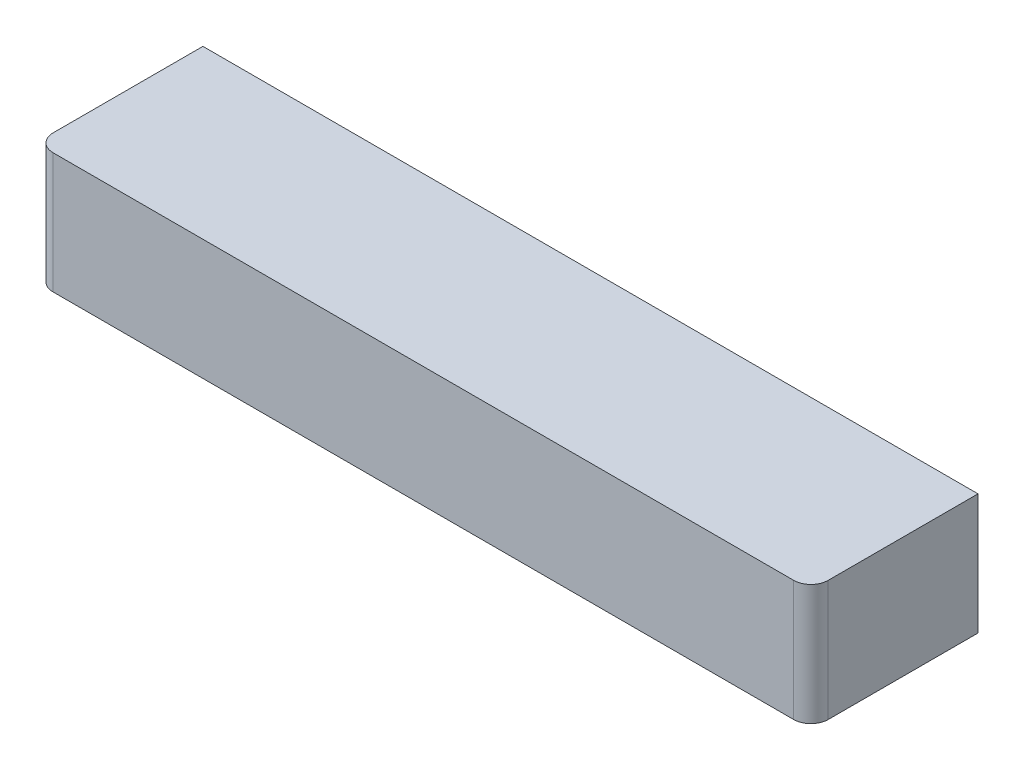
ISO-10303-21;
HEADER;
FILE_DESCRIPTION(('STEP AP214'),'2;1');
FILE_NAME('part.step','',(''),(''),'','','');
FILE_SCHEMA(('AUTOMOTIVE_DESIGN { 1 0 10303 214 1 1 1 1 }'));
ENDSEC;
DATA;
#1=APPLICATION_CONTEXT('core data for automotive mechanical design processes');
#2=APPLICATION_PROTOCOL_DEFINITION('international standard','automotive_design',2000,#1);
#3=PRODUCT_CONTEXT('',#1,'mechanical');
#4=PRODUCT('Part','Part','',(#3));
#5=PRODUCT_RELATED_PRODUCT_CATEGORY('part','',(#4));
#6=PRODUCT_DEFINITION_FORMATION('','',#4);
#7=PRODUCT_DEFINITION_CONTEXT('part definition',#1,'design');
#8=PRODUCT_DEFINITION('design','',#6,#7);
#9=PRODUCT_DEFINITION_SHAPE('','',#8);
#10=(LENGTH_UNIT() NAMED_UNIT(*) SI_UNIT(.MILLI.,.METRE.));
#11=(NAMED_UNIT(*) PLANE_ANGLE_UNIT() SI_UNIT($,.RADIAN.));
#12=(NAMED_UNIT(*) SI_UNIT($,.STERADIAN.) SOLID_ANGLE_UNIT());
#13=UNCERTAINTY_MEASURE_WITH_UNIT(LENGTH_MEASURE(1.E-05),#10,'distance_accuracy_value','');
#14=(GEOMETRIC_REPRESENTATION_CONTEXT(3) GLOBAL_UNCERTAINTY_ASSIGNED_CONTEXT((#13)) GLOBAL_UNIT_ASSIGNED_CONTEXT((#10,
#11,#12)) REPRESENTATION_CONTEXT('',''));
#15=CARTESIAN_POINT('',(0.,0.,0.));
#16=DIRECTION('',(0.,0.,1.));
#17=DIRECTION('',(1.,0.,0.));
#18=AXIS2_PLACEMENT_3D('',#15,#16,#17);
#19=CARTESIAN_POINT('',(-255.3123172162,70.,84.3644463099746));
#20=DIRECTION('',(1.,0.,0.));
#21=DIRECTION('',(0.,0.,-1.));
#22=AXIS2_PLACEMENT_3D('',#19,#20,#21);
#23=PLANE('',#22);
#24=DIRECTION('',(0.,0.,1.));
#25=VECTOR('',#24,1.);
#26=CARTESIAN_POINT('',(-255.3123172162,0.,84.3644463099746));
#27=LINE('',#26,#25);
#28=CARTESIAN_POINT('',(-255.3123172162,0.,-12.6355536900254));
#29=VERTEX_POINT('',#28);
#30=CARTESIAN_POINT('',(-255.3123172162,0.,74.3644463099746));
#31=VERTEX_POINT('',#30);
#32=EDGE_CURVE('E112',#29,#31,#27,.T.);
#33=ORIENTED_EDGE('',*,*,#32,.T.);
#34=DIRECTION('',(0.,-1.,0.));
#35=VECTOR('',#34,1.);
#36=CARTESIAN_POINT('',(-255.3123172162,70.,74.3644463099746));
#37=LINE('',#36,#35);
#38=CARTESIAN_POINT('',(-255.3123172162,70.,74.3644463099746));
#39=VERTEX_POINT('',#38);
#40=EDGE_CURVE('E56',#31,#39,#37,.F.);
#41=ORIENTED_EDGE('',*,*,#40,.T.);
#42=DIRECTION('',(0.,0.,1.));
#43=VECTOR('',#42,1.);
#44=CARTESIAN_POINT('',(-255.3123172162,70.,84.3644463099746));
#45=LINE('',#44,#43);
#46=CARTESIAN_POINT('',(-255.3123172162,70.,-12.6355536900254));
#47=VERTEX_POINT('',#46);
#48=EDGE_CURVE('E120',#47,#39,#45,.T.);
#49=ORIENTED_EDGE('',*,*,#48,.F.);
#50=DIRECTION('',(0.,-1.,0.));
#51=VECTOR('',#50,1.);
#52=CARTESIAN_POINT('',(-255.3123172162,70.,-12.6355536900254));
#53=LINE('',#52,#51);
#54=EDGE_CURVE('E104',#47,#29,#53,.T.);
#55=ORIENTED_EDGE('',*,*,#54,.T.);
#56=EDGE_LOOP('',(#33,#41,#49,#55));
#57=FACE_BOUND('',#56,.T.);
#58=ADVANCED_FACE('F33',(#57),#23,.F.);
#59=CARTESIAN_POINT('',(-255.3123172162,70.,84.3644463099746));
#60=DIRECTION('',(0.,0.,-1.));
#61=DIRECTION('',(-1.,0.,0.));
#62=AXIS2_PLACEMENT_3D('',#59,#60,#61);
#63=PLANE('',#62);
#64=DIRECTION('',(1.,0.,0.));
#65=VECTOR('',#64,1.);
#66=CARTESIAN_POINT('',(-255.3123172162,70.,84.3644463099746));
#67=LINE('',#66,#65);
#68=CARTESIAN_POINT('',(-245.3123172162,70.,84.3644463099746));
#69=VERTEX_POINT('',#68);
#70=CARTESIAN_POINT('',(184.6876827838,70.,84.3644463099746));
#71=VERTEX_POINT('',#70);
#72=EDGE_CURVE('E94',#69,#71,#67,.T.);
#73=ORIENTED_EDGE('',*,*,#72,.F.);
#74=DIRECTION('',(0.,-1.,0.));
#75=VECTOR('',#74,1.);
#76=CARTESIAN_POINT('',(-245.3123172162,70.,84.3644463099746));
#77=LINE('',#76,#75);
#78=CARTESIAN_POINT('',(-245.3123172162,0.,84.3644463099746));
#79=VERTEX_POINT('',#78);
#80=EDGE_CURVE('E123',#69,#79,#77,.T.);
#81=ORIENTED_EDGE('',*,*,#80,.T.);
#82=DIRECTION('',(1.,0.,0.));
#83=VECTOR('',#82,1.);
#84=CARTESIAN_POINT('',(-255.3123172162,0.,84.3644463099746));
#85=LINE('',#84,#83);
#86=CARTESIAN_POINT('',(184.6876827838,0.,84.3644463099746));
#87=VERTEX_POINT('',#86);
#88=EDGE_CURVE('E114',#79,#87,#85,.T.);
#89=ORIENTED_EDGE('',*,*,#88,.T.);
#90=DIRECTION('',(0.,-1.,0.));
#91=VECTOR('',#90,1.);
#92=CARTESIAN_POINT('',(184.6876827838,70.,84.3644463099746));
#93=LINE('',#92,#91);
#94=EDGE_CURVE('E103',#87,#71,#93,.F.);
#95=ORIENTED_EDGE('',*,*,#94,.T.);
#96=EDGE_LOOP('',(#73,#81,#89,#95));
#97=FACE_BOUND('',#96,.T.);
#98=ADVANCED_FACE('F136',(#97),#63,.F.);
#99=CARTESIAN_POINT('',(194.6876827838,70.,84.3644463099746));
#100=DIRECTION('',(-1.,0.,0.));
#101=DIRECTION('',(0.,0.,1.));
#102=AXIS2_PLACEMENT_3D('',#99,#100,#101);
#103=PLANE('',#102);
#104=DIRECTION('',(0.,0.,-1.));
#105=VECTOR('',#104,1.);
#106=CARTESIAN_POINT('',(194.6876827838,70.,84.3644463099746));
#107=LINE('',#106,#105);
#108=CARTESIAN_POINT('',(194.6876827838,70.,74.3644463099746));
#109=VERTEX_POINT('',#108);
#110=CARTESIAN_POINT('',(194.6876827838,70.,-12.6355536900254));
#111=VERTEX_POINT('',#110);
#112=EDGE_CURVE('E86',#109,#111,#107,.T.);
#113=ORIENTED_EDGE('',*,*,#112,.F.);
#114=DIRECTION('',(0.,-1.,0.));
#115=VECTOR('',#114,1.);
#116=CARTESIAN_POINT('',(194.6876827838,70.,74.3644463099746));
#117=LINE('',#116,#115);
#118=CARTESIAN_POINT('',(194.6876827838,0.,74.3644463099746));
#119=VERTEX_POINT('',#118);
#120=EDGE_CURVE('E11',#109,#119,#117,.T.);
#121=ORIENTED_EDGE('',*,*,#120,.T.);
#122=DIRECTION('',(0.,0.,-1.));
#123=VECTOR('',#122,1.);
#124=CARTESIAN_POINT('',(194.6876827838,0.,84.3644463099746));
#125=LINE('',#124,#123);
#126=CARTESIAN_POINT('',(194.6876827838,0.,-12.6355536900254));
#127=VERTEX_POINT('',#126);
#128=EDGE_CURVE('E100',#119,#127,#125,.T.);
#129=ORIENTED_EDGE('',*,*,#128,.T.);
#130=DIRECTION('',(0.,-1.,0.));
#131=VECTOR('',#130,1.);
#132=CARTESIAN_POINT('',(194.6876827838,70.,-12.6355536900254));
#133=LINE('',#132,#131);
#134=EDGE_CURVE('E97',#111,#127,#133,.T.);
#135=ORIENTED_EDGE('',*,*,#134,.F.);
#136=EDGE_LOOP('',(#113,#121,#129,#135));
#137=FACE_BOUND('',#136,.T.);
#138=ADVANCED_FACE('F98',(#137),#103,.F.);
#139=CARTESIAN_POINT('',(-255.3123172162,70.,-12.6355536900254));
#140=DIRECTION('',(0.,0.,1.));
#141=DIRECTION('',(1.,0.,0.));
#142=AXIS2_PLACEMENT_3D('',#139,#140,#141);
#143=PLANE('',#142);
#144=DIRECTION('',(-1.,0.,0.));
#145=VECTOR('',#144,1.);
#146=CARTESIAN_POINT('',(-255.3123172162,0.,-12.6355536900254));
#147=LINE('',#146,#145);
#148=EDGE_CURVE('E119',#127,#29,#147,.T.);
#149=ORIENTED_EDGE('',*,*,#148,.T.);
#150=ORIENTED_EDGE('',*,*,#54,.F.);
#151=DIRECTION('',(-1.,0.,0.));
#152=VECTOR('',#151,1.);
#153=CARTESIAN_POINT('',(-255.3123172162,70.,-12.6355536900254));
#154=LINE('',#153,#152);
#155=EDGE_CURVE('E90',#111,#47,#154,.T.);
#156=ORIENTED_EDGE('',*,*,#155,.F.);
#157=ORIENTED_EDGE('',*,*,#134,.T.);
#158=EDGE_LOOP('',(#149,#150,#156,#157));
#159=FACE_BOUND('',#158,.T.);
#160=ADVANCED_FACE('F106',(#159),#143,.F.);
#161=CARTESIAN_POINT('',(0.,70.,0.));
#162=DIRECTION('',(0.,-1.,0.));
#163=DIRECTION('',(0.,0.,-1.));
#164=AXIS2_PLACEMENT_3D('',#161,#162,#163);
#165=PLANE('',#164);
#166=ORIENTED_EDGE('',*,*,#48,.T.);
#167=CARTESIAN_POINT('',(-245.3123172162,70.,74.3644463099746));
#168=DIRECTION('',(0.,-1.,0.));
#169=DIRECTION('',(0.,0.,-1.));
#170=AXIS2_PLACEMENT_3D('',#167,#168,#169);
#171=CIRCLE('',#170,10.);
#172=EDGE_CURVE('E41',#39,#69,#171,.F.);
#173=ORIENTED_EDGE('',*,*,#172,.T.);
#174=ORIENTED_EDGE('',*,*,#72,.T.);
#175=CARTESIAN_POINT('',(184.6876827838,70.,74.3644463099746));
#176=DIRECTION('',(0.,-1.,0.));
#177=DIRECTION('',(0.,0.,-1.));
#178=AXIS2_PLACEMENT_3D('',#175,#176,#177);
#179=CIRCLE('',#178,10.);
#180=EDGE_CURVE('E48',#71,#109,#179,.F.);
#181=ORIENTED_EDGE('',*,*,#180,.T.);
#182=ORIENTED_EDGE('',*,*,#112,.T.);
#183=ORIENTED_EDGE('',*,*,#155,.T.);
#184=EDGE_LOOP('',(#166,#173,#174,#181,#182,#183));
#185=FACE_BOUND('',#184,.T.);
#186=ADVANCED_FACE('F88',(#185),#165,.F.);
#187=CARTESIAN_POINT('',(0.,0.,0.));
#188=DIRECTION('',(0.,-1.,0.));
#189=DIRECTION('',(0.,0.,-1.));
#190=AXIS2_PLACEMENT_3D('',#187,#188,#189);
#191=PLANE('',#190);
#192=CARTESIAN_POINT('',(184.6876827838,0.,44.3644463099746));
#193=DIRECTION('',(0.,-1.,0.));
#194=DIRECTION('',(0.,0.,-1.));
#195=AXIS2_PLACEMENT_3D('',#192,#193,#194);
#196=CIRCLE('',#195,1.5);
#197=CARTESIAN_POINT('',(184.6876827838,0.,42.8644463099746));
#198=VERTEX_POINT('',#197);
#199=EDGE_CURVE('E151',#198,#198,#196,.T.);
#200=ORIENTED_EDGE('',*,*,#199,.F.);
#201=EDGE_LOOP('',(#200));
#202=FACE_BOUND('',#201,.T.);
#203=CARTESIAN_POINT('',(-245.3123172162,0.,44.3644463099746));
#204=DIRECTION('',(0.,-1.,0.));
#205=DIRECTION('',(0.,0.,-1.));
#206=AXIS2_PLACEMENT_3D('',#203,#204,#205);
#207=CIRCLE('',#206,1.5);
#208=CARTESIAN_POINT('',(-245.3123172162,0.,42.8644463099746));
#209=VERTEX_POINT('',#208);
#210=EDGE_CURVE('E145',#209,#209,#207,.T.);
#211=ORIENTED_EDGE('',*,*,#210,.F.);
#212=EDGE_LOOP('',(#211));
#213=FACE_BOUND('',#212,.T.);
#214=ORIENTED_EDGE('',*,*,#88,.F.);
#215=CARTESIAN_POINT('',(-245.3123172162,0.,74.3644463099746));
#216=DIRECTION('',(0.,-1.,0.));
#217=DIRECTION('',(0.,0.,-1.));
#218=AXIS2_PLACEMENT_3D('',#215,#216,#217);
#219=CIRCLE('',#218,10.);
#220=EDGE_CURVE('E128',#79,#31,#219,.T.);
#221=ORIENTED_EDGE('',*,*,#220,.T.);
#222=ORIENTED_EDGE('',*,*,#32,.F.);
#223=ORIENTED_EDGE('',*,*,#148,.F.);
#224=ORIENTED_EDGE('',*,*,#128,.F.);
#225=CARTESIAN_POINT('',(184.6876827838,0.,74.3644463099746));
#226=DIRECTION('',(0.,-1.,0.));
#227=DIRECTION('',(0.,0.,-1.));
#228=AXIS2_PLACEMENT_3D('',#225,#226,#227);
#229=CIRCLE('',#228,10.);
#230=EDGE_CURVE('E126',#119,#87,#229,.T.);
#231=ORIENTED_EDGE('',*,*,#230,.T.);
#232=EDGE_LOOP('',(#214,#221,#222,#223,#224,#231));
#233=FACE_BOUND('',#232,.T.);
#234=ADVANCED_FACE('F142',(#202,#213,#233),#191,.T.);
#235=CARTESIAN_POINT('',(-245.3123172162,70.,74.3644463099746));
#236=DIRECTION('',(0.,-1.,0.));
#237=DIRECTION('',(0.,0.,-1.));
#238=AXIS2_PLACEMENT_3D('',#235,#236,#237);
#239=CYLINDRICAL_SURFACE('',#238,10.);
#240=ORIENTED_EDGE('',*,*,#172,.F.);
#241=ORIENTED_EDGE('',*,*,#40,.F.);
#242=ORIENTED_EDGE('',*,*,#220,.F.);
#243=ORIENTED_EDGE('',*,*,#80,.F.);
#244=EDGE_LOOP('',(#240,#241,#242,#243));
#245=FACE_BOUND('',#244,.T.);
#246=ADVANCED_FACE('F139',(#245),#239,.T.);
#247=CARTESIAN_POINT('',(184.6876827838,70.,74.3644463099746));
#248=DIRECTION('',(0.,-1.,0.));
#249=DIRECTION('',(0.,0.,-1.));
#250=AXIS2_PLACEMENT_3D('',#247,#248,#249);
#251=CYLINDRICAL_SURFACE('',#250,10.);
#252=ORIENTED_EDGE('',*,*,#180,.F.);
#253=ORIENTED_EDGE('',*,*,#94,.F.);
#254=ORIENTED_EDGE('',*,*,#230,.F.);
#255=ORIENTED_EDGE('',*,*,#120,.F.);
#256=EDGE_LOOP('',(#252,#253,#254,#255));
#257=FACE_BOUND('',#256,.T.);
#258=ADVANCED_FACE('F35',(#257),#251,.T.);
#259=CARTESIAN_POINT('',(-245.3123172162,20.,44.3644463099746));
#260=DIRECTION('',(0.,-1.,0.));
#261=DIRECTION('',(0.,0.,-1.));
#262=AXIS2_PLACEMENT_3D('',#259,#260,#261);
#263=CYLINDRICAL_SURFACE('',#262,1.5);
#264=CARTESIAN_POINT('',(-245.3123172162,20.,44.3644463099746));
#265=DIRECTION('',(0.,-1.,0.));
#266=DIRECTION('',(0.,0.,-1.));
#267=AXIS2_PLACEMENT_3D('',#264,#265,#266);
#268=CIRCLE('',#267,1.5);
#269=CARTESIAN_POINT('',(-245.3123172162,20.,42.8644463099746));
#270=VERTEX_POINT('',#269);
#271=EDGE_CURVE('E148',#270,#270,#268,.T.);
#272=ORIENTED_EDGE('',*,*,#271,.F.);
#273=EDGE_LOOP('',(#272));
#274=FACE_BOUND('',#273,.T.);
#275=ORIENTED_EDGE('',*,*,#210,.T.);
#276=EDGE_LOOP('',(#275));
#277=FACE_BOUND('',#276,.T.);
#278=ADVANCED_FACE('F171',(#274,#277),#263,.F.);
#279=CARTESIAN_POINT('',(-245.3123172162,20.,44.3644463099746));
#280=DIRECTION('',(0.,-1.,0.));
#281=DIRECTION('',(0.,0.,-1.));
#282=AXIS2_PLACEMENT_3D('',#279,#280,#281);
#283=PLANE('',#282);
#284=ORIENTED_EDGE('',*,*,#271,.T.);
#285=EDGE_LOOP('',(#284));
#286=FACE_BOUND('',#285,.T.);
#287=ADVANCED_FACE('F162',(#286),#283,.T.);
#288=CARTESIAN_POINT('',(184.6876827838,20.,44.3644463099746));
#289=DIRECTION('',(0.,-1.,0.));
#290=DIRECTION('',(0.,0.,-1.));
#291=AXIS2_PLACEMENT_3D('',#288,#289,#290);
#292=CYLINDRICAL_SURFACE('',#291,1.5);
#293=CARTESIAN_POINT('',(184.6876827838,20.,44.3644463099746));
#294=DIRECTION('',(0.,-1.,0.));
#295=DIRECTION('',(0.,0.,-1.));
#296=AXIS2_PLACEMENT_3D('',#293,#294,#295);
#297=CIRCLE('',#296,1.5);
#298=CARTESIAN_POINT('',(184.6876827838,20.,42.8644463099746));
#299=VERTEX_POINT('',#298);
#300=EDGE_CURVE('E115',#299,#299,#297,.T.);
#301=ORIENTED_EDGE('',*,*,#300,.F.);
#302=EDGE_LOOP('',(#301));
#303=FACE_BOUND('',#302,.T.);
#304=ORIENTED_EDGE('',*,*,#199,.T.);
#305=EDGE_LOOP('',(#304));
#306=FACE_BOUND('',#305,.T.);
#307=ADVANCED_FACE('F159',(#303,#306),#292,.F.);
#308=CARTESIAN_POINT('',(184.6876827838,20.,44.3644463099746));
#309=DIRECTION('',(0.,-1.,0.));
#310=DIRECTION('',(0.,0.,-1.));
#311=AXIS2_PLACEMENT_3D('',#308,#309,#310);
#312=PLANE('',#311);
#313=ORIENTED_EDGE('',*,*,#300,.T.);
#314=EDGE_LOOP('',(#313));
#315=FACE_BOUND('',#314,.T.);
#316=ADVANCED_FACE('F157',(#315),#312,.T.);
#317=CLOSED_SHELL('',(#58,#98,#138,#160,#186,#234,#246,#258,#278,#287,#307,#316));
#318=MANIFOLD_SOLID_BREP('B2',#317);
#319=ADVANCED_BREP_SHAPE_REPRESENTATION('',(#18,#318),#14);
#320=SHAPE_DEFINITION_REPRESENTATION(#9,#319);
ENDSEC;
END-ISO-10303-21;
